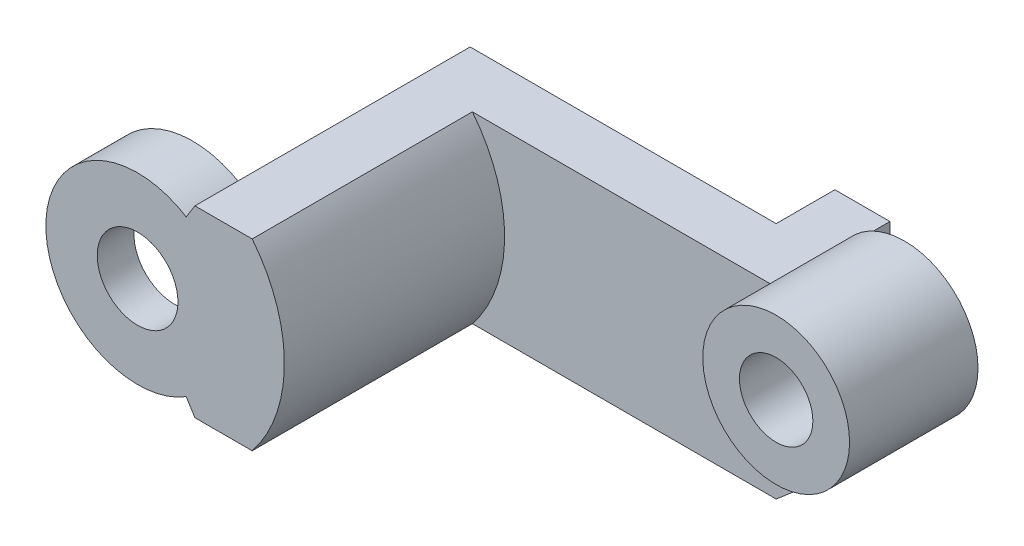
ISO-10303-21;
HEADER;
FILE_DESCRIPTION(('STEP AP214'),'2;1');
FILE_NAME('part.step','',(''),(''),'','','');
FILE_SCHEMA(('AUTOMOTIVE_DESIGN { 1 0 10303 214 1 1 1 1 }'));
ENDSEC;
DATA;
#1=APPLICATION_CONTEXT('core data for automotive mechanical design processes');
#2=APPLICATION_PROTOCOL_DEFINITION('international standard','automotive_design',2000,#1);
#3=PRODUCT_CONTEXT('',#1,'mechanical');
#4=PRODUCT('Part','Part','',(#3));
#5=PRODUCT_RELATED_PRODUCT_CATEGORY('part','',(#4));
#6=PRODUCT_DEFINITION_FORMATION('','',#4);
#7=PRODUCT_DEFINITION_CONTEXT('part definition',#1,'design');
#8=PRODUCT_DEFINITION('design','',#6,#7);
#9=PRODUCT_DEFINITION_SHAPE('','',#8);
#10=(LENGTH_UNIT() NAMED_UNIT(*) SI_UNIT(.MILLI.,.METRE.));
#11=(NAMED_UNIT(*) PLANE_ANGLE_UNIT() SI_UNIT($,.RADIAN.));
#12=(NAMED_UNIT(*) SI_UNIT($,.STERADIAN.) SOLID_ANGLE_UNIT());
#13=UNCERTAINTY_MEASURE_WITH_UNIT(LENGTH_MEASURE(1.E-05),#10,'distance_accuracy_value','');
#14=(GEOMETRIC_REPRESENTATION_CONTEXT(3) GLOBAL_UNCERTAINTY_ASSIGNED_CONTEXT((#13)) GLOBAL_UNIT_ASSIGNED_CONTEXT((#10,
#11,#12)) REPRESENTATION_CONTEXT('',''));
#15=CARTESIAN_POINT('',(0.,0.,0.));
#16=DIRECTION('',(0.,0.,1.));
#17=DIRECTION('',(1.,0.,0.));
#18=AXIS2_PLACEMENT_3D('',#15,#16,#17);
#19=CARTESIAN_POINT('',(13.4,1.84,-6.));
#20=DIRECTION('',(0.,0.,-1.));
#21=DIRECTION('',(-1.,0.,0.));
#22=AXIS2_PLACEMENT_3D('',#19,#20,#21);
#23=PLANE('',#22);
#24=CARTESIAN_POINT('',(13.4,1.84,-6.));
#25=DIRECTION('',(0.,0.,1.));
#26=DIRECTION('',(1.,0.,0.));
#27=AXIS2_PLACEMENT_3D('',#24,#25,#26);
#28=CIRCLE('',#27,2.);
#29=CARTESIAN_POINT('',(11.5120381359784,2.5,-6.));
#30=VERTEX_POINT('',#29);
#31=CARTESIAN_POINT('',(14.699339627599,0.319566991889854,-6.));
#32=VERTEX_POINT('',#31);
#33=EDGE_CURVE('E143',#30,#32,#28,.T.);
#34=ORIENTED_EDGE('',*,*,#33,.F.);
#35=DIRECTION('',(1.,0.,0.));
#36=VECTOR('',#35,1.);
#37=CARTESIAN_POINT('',(3.1224989991992,2.5,-6.));
#38=LINE('',#37,#36);
#39=CARTESIAN_POINT('',(3.1224989991992,2.5,-6.));
#40=VERTEX_POINT('',#39);
#41=EDGE_CURVE('E149',#40,#30,#38,.T.);
#42=ORIENTED_EDGE('',*,*,#41,.F.);
#43=CARTESIAN_POINT('',(0.,0.,-6.));
#44=DIRECTION('',(0.,0.,-1.));
#45=DIRECTION('',(-1.,0.,0.));
#46=AXIS2_PLACEMENT_3D('',#43,#44,#45);
#47=CIRCLE('',#46,4.);
#48=CARTESIAN_POINT('',(3.1224989991992,-2.5,-6.));
#49=VERTEX_POINT('',#48);
#50=EDGE_CURVE('E11',#49,#40,#47,.F.);
#51=ORIENTED_EDGE('',*,*,#50,.F.);
#52=DIRECTION('',(-1.,0.,0.));
#53=VECTOR('',#52,1.);
#54=CARTESIAN_POINT('',(3.1224989991992,-2.5,-6.));
#55=LINE('',#54,#53);
#56=CARTESIAN_POINT('',(11.4,-2.5,-6.));
#57=VERTEX_POINT('',#56);
#58=EDGE_CURVE('E146',#57,#49,#55,.T.);
#59=ORIENTED_EDGE('',*,*,#58,.F.);
#60=DIRECTION('',(-0.760216504055072,-0.649669813799506,0.));
#61=VECTOR('',#60,1.);
#62=CARTESIAN_POINT('',(14.699339627599,0.319566991889854,-6.));
#63=LINE('',#62,#61);
#64=EDGE_CURVE('E140',#32,#57,#63,.T.);
#65=ORIENTED_EDGE('',*,*,#64,.F.);
#66=EDGE_LOOP('',(#34,#42,#51,#59,#65));
#67=FACE_BOUND('',#66,.T.);
#68=ADVANCED_FACE('F39',(#67),#23,.F.);
#69=CARTESIAN_POINT('',(0.,0.,-7.5));
#70=DIRECTION('',(0.,0.,1.));
#71=DIRECTION('',(1.,0.,0.));
#72=AXIS2_PLACEMENT_3D('',#69,#70,#71);
#73=PLANE('',#72);
#74=CARTESIAN_POINT('',(13.4,1.84,-7.5));
#75=DIRECTION('',(0.,0.,-1.));
#76=DIRECTION('',(-1.,0.,0.));
#77=AXIS2_PLACEMENT_3D('',#74,#75,#76);
#78=CIRCLE('',#77,1.);
#79=CARTESIAN_POINT('',(12.4,1.84,-7.5));
#80=VERTEX_POINT('',#79);
#81=EDGE_CURVE('E210',#80,#80,#78,.T.);
#82=ORIENTED_EDGE('',*,*,#81,.F.);
#83=EDGE_LOOP('',(#82));
#84=FACE_BOUND('',#83,.T.);
#85=DIRECTION('',(0.,-1.,0.));
#86=VECTOR('',#85,1.);
#87=CARTESIAN_POINT('',(11.4,-2.5,-7.5));
#88=LINE('',#87,#86);
#89=CARTESIAN_POINT('',(11.4,2.5,-7.5));
#90=VERTEX_POINT('',#89);
#91=CARTESIAN_POINT('',(11.4,-2.5,-7.5));
#92=VERTEX_POINT('',#91);
#93=EDGE_CURVE('E63',#90,#92,#88,.T.);
#94=ORIENTED_EDGE('',*,*,#93,.F.);
#95=DIRECTION('',(-1.,0.,0.));
#96=VECTOR('',#95,1.);
#97=CARTESIAN_POINT('',(3.1224989991992,2.5,-7.5));
#98=LINE('',#97,#96);
#99=CARTESIAN_POINT('',(11.5120381359784,2.5,-7.5));
#100=VERTEX_POINT('',#99);
#101=EDGE_CURVE('E237',#100,#90,#98,.T.);
#102=ORIENTED_EDGE('',*,*,#101,.F.);
#103=CARTESIAN_POINT('',(13.4,1.84,-7.5));
#104=DIRECTION('',(0.,0.,-1.));
#105=DIRECTION('',(-1.,0.,0.));
#106=AXIS2_PLACEMENT_3D('',#103,#104,#105);
#107=CIRCLE('',#106,2.);
#108=CARTESIAN_POINT('',(14.699339627599,0.319566991889854,-7.5));
#109=VERTEX_POINT('',#108);
#110=EDGE_CURVE('E214',#100,#109,#107,.T.);
#111=ORIENTED_EDGE('',*,*,#110,.T.);
#112=DIRECTION('',(-0.760216504055072,-0.649669813799506,0.));
#113=VECTOR('',#112,1.);
#114=CARTESIAN_POINT('',(14.699339627599,0.319566991889854,-7.5));
#115=LINE('',#114,#113);
#116=EDGE_CURVE('E154',#109,#92,#115,.T.);
#117=ORIENTED_EDGE('',*,*,#116,.T.);
#118=EDGE_LOOP('',(#94,#102,#111,#117));
#119=FACE_BOUND('',#118,.T.);
#120=ADVANCED_FACE('F330',(#84,#119),#73,.F.);
#121=DIRECTION('',(0.,1.,0.));
#122=VECTOR('',#121,1.);
#123=CARTESIAN_POINT('',(9.9,-2.5,-7.5));
#124=LINE('',#123,#122);
#125=CARTESIAN_POINT('',(9.9,-2.5,-7.5));
#126=VERTEX_POINT('',#125);
#127=CARTESIAN_POINT('',(9.9,2.5,-7.5));
#128=VERTEX_POINT('',#127);
#129=EDGE_CURVE('E55',#126,#128,#124,.T.);
#130=ORIENTED_EDGE('',*,*,#129,.F.);
#131=DIRECTION('',(1.,0.,0.));
#132=VECTOR('',#131,1.);
#133=CARTESIAN_POINT('',(3.1224989991992,-2.5,-7.5));
#134=LINE('',#133,#132);
#135=CARTESIAN_POINT('',(1.5612494995996,-2.5,-7.5));
#136=VERTEX_POINT('',#135);
#137=EDGE_CURVE('E232',#136,#126,#134,.T.);
#138=ORIENTED_EDGE('',*,*,#137,.F.);
#139=DIRECTION('',(0.52969381681151,-0.848188929679971,0.));
#140=VECTOR('',#139,1.);
#141=CARTESIAN_POINT('',(1.5612494995996,-2.5,-7.5));
#142=LINE('',#141,#140);
#143=CARTESIAN_POINT('',(1.32423454202877,-2.12047232419993,-7.5));
#144=VERTEX_POINT('',#143);
#145=EDGE_CURVE('E228',#144,#136,#142,.T.);
#146=ORIENTED_EDGE('',*,*,#145,.F.);
#147=CARTESIAN_POINT('',(0.,0.,-7.5));
#148=DIRECTION('',(0.,0.,-1.));
#149=DIRECTION('',(1.,0.,0.));
#150=AXIS2_PLACEMENT_3D('',#147,#148,#149);
#151=CIRCLE('',#150,2.5);
#152=CARTESIAN_POINT('',(1.32423454202877,2.12047232419993,-7.5));
#153=VERTEX_POINT('',#152);
#154=EDGE_CURVE('E244',#153,#144,#151,.T.);
#155=ORIENTED_EDGE('',*,*,#154,.F.);
#156=DIRECTION('',(-0.529693816811509,-0.848188929679971,0.));
#157=VECTOR('',#156,1.);
#158=CARTESIAN_POINT('',(1.5612494995996,2.5,-7.5));
#159=LINE('',#158,#157);
#160=CARTESIAN_POINT('',(1.5612494995996,2.5,-7.5));
#161=VERTEX_POINT('',#160);
#162=EDGE_CURVE('E240',#161,#153,#159,.T.);
#163=ORIENTED_EDGE('',*,*,#162,.F.);
#164=EDGE_CURVE('E236',#128,#161,#98,.T.);
#165=ORIENTED_EDGE('',*,*,#164,.F.);
#166=EDGE_LOOP('',(#130,#138,#146,#155,#163,#165));
#167=FACE_BOUND('',#166,.T.);
#168=ADVANCED_FACE('F325',(#167),#73,.F.);
#169=CARTESIAN_POINT('',(0.,0.,-7.5));
#170=DIRECTION('',(0.,0.,1.));
#171=DIRECTION('',(1.,0.,0.));
#172=AXIS2_PLACEMENT_3D('',#169,#170,#171);
#173=CYLINDRICAL_SURFACE('',#172,4.);
#174=DIRECTION('',(0.,0.,1.));
#175=VECTOR('',#174,1.);
#176=CARTESIAN_POINT('',(3.1224989991992,-2.5,-7.5));
#177=LINE('',#176,#175);
#178=CARTESIAN_POINT('',(3.1224989991992,-2.5,0.));
#179=VERTEX_POINT('',#178);
#180=EDGE_CURVE('E284',#49,#179,#177,.T.);
#181=ORIENTED_EDGE('',*,*,#180,.F.);
#182=ORIENTED_EDGE('',*,*,#50,.T.);
#183=DIRECTION('',(0.,0.,1.));
#184=VECTOR('',#183,1.);
#185=CARTESIAN_POINT('',(3.1224989991992,2.5,-7.5));
#186=LINE('',#185,#184);
#187=CARTESIAN_POINT('',(3.1224989991992,2.5,0.));
#188=VERTEX_POINT('',#187);
#189=EDGE_CURVE('E281',#40,#188,#186,.T.);
#190=ORIENTED_EDGE('',*,*,#189,.T.);
#191=CARTESIAN_POINT('',(0.,0.,0.));
#192=DIRECTION('',(0.,0.,1.));
#193=DIRECTION('',(1.,0.,0.));
#194=AXIS2_PLACEMENT_3D('',#191,#192,#193);
#195=CIRCLE('',#194,4.);
#196=EDGE_CURVE('E256',#179,#188,#195,.T.);
#197=ORIENTED_EDGE('',*,*,#196,.F.);
#198=EDGE_LOOP('',(#181,#182,#190,#197));
#199=FACE_BOUND('',#198,.T.);
#200=ADVANCED_FACE('F316',(#199),#173,.T.);
#201=CARTESIAN_POINT('',(0.,0.,-1.));
#202=DIRECTION('',(0.,0.,1.));
#203=DIRECTION('',(1.,0.,0.));
#204=AXIS2_PLACEMENT_3D('',#201,#202,#203);
#205=PLANE('',#204);
#206=CARTESIAN_POINT('',(0.,0.,-1.));
#207=DIRECTION('',(0.,0.,1.));
#208=DIRECTION('',(1.,0.,0.));
#209=AXIS2_PLACEMENT_3D('',#206,#207,#208);
#210=CIRCLE('',#209,1.1);
#211=CARTESIAN_POINT('',(1.1,0.,-1.));
#212=VERTEX_POINT('',#211);
#213=EDGE_CURVE('E298',#212,#212,#210,.T.);
#214=ORIENTED_EDGE('',*,*,#213,.T.);
#215=EDGE_LOOP('',(#214));
#216=FACE_BOUND('',#215,.T.);
#217=CARTESIAN_POINT('',(0.,0.,-1.));
#218=DIRECTION('',(0.,0.,1.));
#219=DIRECTION('',(1.,0.,0.));
#220=AXIS2_PLACEMENT_3D('',#217,#218,#219);
#221=CIRCLE('',#220,2.05);
#222=CARTESIAN_POINT('',(2.05,0.,-1.));
#223=VERTEX_POINT('',#222);
#224=EDGE_CURVE('E48',#223,#223,#221,.T.);
#225=ORIENTED_EDGE('',*,*,#224,.F.);
#226=EDGE_LOOP('',(#225));
#227=FACE_BOUND('',#226,.T.);
#228=ADVANCED_FACE('F314',(#216,#227),#205,.F.);
#229=CARTESIAN_POINT('',(0.,0.,-1.));
#230=DIRECTION('',(0.,0.,1.));
#231=DIRECTION('',(1.,0.,0.));
#232=AXIS2_PLACEMENT_3D('',#229,#230,#231);
#233=CYLINDRICAL_SURFACE('',#232,2.5);
#234=DIRECTION('',(0.,0.,1.));
#235=VECTOR('',#234,1.);
#236=CARTESIAN_POINT('',(1.32423454202877,-2.12047232419993,-7.5));
#237=LINE('',#236,#235);
#238=CARTESIAN_POINT('',(1.32423454202877,-2.12047232419993,-1.5));
#239=VERTEX_POINT('',#238);
#240=CARTESIAN_POINT('',(1.32423454202877,-2.12047232419993,0.));
#241=VERTEX_POINT('',#240);
#242=EDGE_CURVE('E272',#239,#241,#237,.T.);
#243=ORIENTED_EDGE('',*,*,#242,.T.);
#244=CARTESIAN_POINT('',(0.,0.,0.));
#245=DIRECTION('',(0.,0.,1.));
#246=DIRECTION('',(1.,0.,0.));
#247=AXIS2_PLACEMENT_3D('',#244,#245,#246);
#248=CIRCLE('',#247,2.5);
#249=CARTESIAN_POINT('',(1.32423454202877,2.12047232419993,0.));
#250=VERTEX_POINT('',#249);
#251=EDGE_CURVE('E302',#250,#241,#248,.T.);
#252=ORIENTED_EDGE('',*,*,#251,.F.);
#253=DIRECTION('',(0.,0.,1.));
#254=VECTOR('',#253,1.);
#255=CARTESIAN_POINT('',(1.32423454202877,2.12047232419993,-7.5));
#256=LINE('',#255,#254);
#257=CARTESIAN_POINT('',(1.32423454202877,2.12047232419993,-1.5));
#258=VERTEX_POINT('',#257);
#259=EDGE_CURVE('E277',#258,#250,#256,.T.);
#260=ORIENTED_EDGE('',*,*,#259,.F.);
#261=CARTESIAN_POINT('',(0.,0.,-1.5));
#262=DIRECTION('',(0.,0.,1.));
#263=DIRECTION('',(1.,0.,0.));
#264=AXIS2_PLACEMENT_3D('',#261,#262,#263);
#265=CIRCLE('',#264,2.5);
#266=EDGE_CURVE('E293',#258,#239,#265,.T.);
#267=ORIENTED_EDGE('',*,*,#266,.T.);
#268=EDGE_LOOP('',(#243,#252,#260,#267));
#269=FACE_BOUND('',#268,.T.);
#270=ADVANCED_FACE('F41',(#269),#233,.T.);
#271=CARTESIAN_POINT('',(0.,0.,0.));
#272=DIRECTION('',(0.,0.,1.));
#273=DIRECTION('',(1.,0.,0.));
#274=AXIS2_PLACEMENT_3D('',#271,#272,#273);
#275=PLANE('',#274);
#276=CARTESIAN_POINT('',(0.,0.,0.));
#277=DIRECTION('',(0.,0.,1.));
#278=DIRECTION('',(1.,0.,0.));
#279=AXIS2_PLACEMENT_3D('',#276,#277,#278);
#280=CIRCLE('',#279,1.1);
#281=CARTESIAN_POINT('',(1.1,0.,0.));
#282=VERTEX_POINT('',#281);
#283=EDGE_CURVE('E297',#282,#282,#280,.T.);
#284=ORIENTED_EDGE('',*,*,#283,.F.);
#285=EDGE_LOOP('',(#284));
#286=FACE_BOUND('',#285,.T.);
#287=ORIENTED_EDGE('',*,*,#251,.T.);
#288=DIRECTION('',(0.52969381681151,-0.848188929679971,0.));
#289=VECTOR('',#288,1.);
#290=CARTESIAN_POINT('',(1.5612494995996,-2.5,0.));
#291=LINE('',#290,#289);
#292=CARTESIAN_POINT('',(1.5612494995996,-2.5,0.));
#293=VERTEX_POINT('',#292);
#294=EDGE_CURVE('E224',#241,#293,#291,.T.);
#295=ORIENTED_EDGE('',*,*,#294,.T.);
#296=DIRECTION('',(1.,0.,0.));
#297=VECTOR('',#296,1.);
#298=CARTESIAN_POINT('',(3.1224989991992,-2.5,0.));
#299=LINE('',#298,#297);
#300=EDGE_CURVE('E252',#293,#179,#299,.T.);
#301=ORIENTED_EDGE('',*,*,#300,.T.);
#302=ORIENTED_EDGE('',*,*,#196,.T.);
#303=DIRECTION('',(-1.,0.,0.));
#304=VECTOR('',#303,1.);
#305=CARTESIAN_POINT('',(3.1224989991992,2.5,0.));
#306=LINE('',#305,#304);
#307=CARTESIAN_POINT('',(1.5612494995996,2.5,0.));
#308=VERTEX_POINT('',#307);
#309=EDGE_CURVE('E260',#188,#308,#306,.T.);
#310=ORIENTED_EDGE('',*,*,#309,.T.);
#311=DIRECTION('',(-0.529693816811509,-0.848188929679971,0.));
#312=VECTOR('',#311,1.);
#313=CARTESIAN_POINT('',(1.5612494995996,2.5,0.));
#314=LINE('',#313,#312);
#315=EDGE_CURVE('E233',#308,#250,#314,.T.);
#316=ORIENTED_EDGE('',*,*,#315,.T.);
#317=EDGE_LOOP('',(#287,#295,#301,#302,#310,#316));
#318=FACE_BOUND('',#317,.T.);
#319=ADVANCED_FACE('F323',(#286,#318),#275,.T.);
#320=CARTESIAN_POINT('',(0.,0.,-1.));
#321=DIRECTION('',(0.,0.,1.));
#322=DIRECTION('',(1.,0.,0.));
#323=AXIS2_PLACEMENT_3D('',#320,#321,#322);
#324=CYLINDRICAL_SURFACE('',#323,1.1);
#325=ORIENTED_EDGE('',*,*,#213,.F.);
#326=EDGE_LOOP('',(#325));
#327=FACE_BOUND('',#326,.T.);
#328=ORIENTED_EDGE('',*,*,#283,.T.);
#329=EDGE_LOOP('',(#328));
#330=FACE_BOUND('',#329,.T.);
#331=ADVANCED_FACE('F371',(#327,#330),#324,.F.);
#332=CARTESIAN_POINT('',(0.,0.,-1.5));
#333=DIRECTION('',(0.,0.,1.));
#334=DIRECTION('',(1.,0.,0.));
#335=AXIS2_PLACEMENT_3D('',#332,#333,#334);
#336=PLANE('',#335);
#337=CARTESIAN_POINT('',(0.,0.,-1.5));
#338=DIRECTION('',(0.,0.,1.));
#339=DIRECTION('',(1.,0.,0.));
#340=AXIS2_PLACEMENT_3D('',#337,#338,#339);
#341=CIRCLE('',#340,2.05);
#342=CARTESIAN_POINT('',(2.05,0.,-1.5));
#343=VERTEX_POINT('',#342);
#344=EDGE_CURVE('E271',#343,#343,#341,.T.);
#345=ORIENTED_EDGE('',*,*,#344,.T.);
#346=EDGE_LOOP('',(#345));
#347=FACE_BOUND('',#346,.T.);
#348=ORIENTED_EDGE('',*,*,#266,.F.);
#349=EDGE_CURVE('E292',#239,#258,#265,.T.);
#350=ORIENTED_EDGE('',*,*,#349,.F.);
#351=EDGE_LOOP('',(#348,#350));
#352=FACE_BOUND('',#351,.T.);
#353=ADVANCED_FACE('F368',(#347,#352),#336,.F.);
#354=CARTESIAN_POINT('',(0.,0.,-1.5));
#355=DIRECTION('',(0.,0.,1.));
#356=DIRECTION('',(1.,0.,0.));
#357=AXIS2_PLACEMENT_3D('',#354,#355,#356);
#358=CYLINDRICAL_SURFACE('',#357,2.05);
#359=ORIENTED_EDGE('',*,*,#344,.F.);
#360=EDGE_LOOP('',(#359));
#361=FACE_BOUND('',#360,.T.);
#362=ORIENTED_EDGE('',*,*,#224,.T.);
#363=EDGE_LOOP('',(#362));
#364=FACE_BOUND('',#363,.T.);
#365=ADVANCED_FACE('F312',(#361,#364),#358,.F.);
#366=CARTESIAN_POINT('',(0.,0.,-7.5));
#367=DIRECTION('',(0.,0.,1.));
#368=DIRECTION('',(1.,0.,0.));
#369=AXIS2_PLACEMENT_3D('',#366,#367,#368);
#370=CYLINDRICAL_SURFACE('',#369,2.5);
#371=ORIENTED_EDGE('',*,*,#349,.T.);
#372=EDGE_CURVE('E273',#153,#258,#256,.T.);
#373=ORIENTED_EDGE('',*,*,#372,.F.);
#374=ORIENTED_EDGE('',*,*,#154,.T.);
#375=EDGE_CURVE('E267',#144,#239,#237,.T.);
#376=ORIENTED_EDGE('',*,*,#375,.T.);
#377=EDGE_LOOP('',(#371,#373,#374,#376));
#378=FACE_BOUND('',#377,.T.);
#379=ADVANCED_FACE('F348',(#378),#370,.F.);
#380=CARTESIAN_POINT('',(1.5612494995996,-2.5,-7.5));
#381=DIRECTION('',(-0.848188929679971,-0.52969381681151,0.));
#382=DIRECTION('',(0.52969381681151,-0.848188929679971,0.));
#383=AXIS2_PLACEMENT_3D('',#380,#381,#382);
#384=PLANE('',#383);
#385=ORIENTED_EDGE('',*,*,#294,.F.);
#386=ORIENTED_EDGE('',*,*,#242,.F.);
#387=ORIENTED_EDGE('',*,*,#375,.F.);
#388=ORIENTED_EDGE('',*,*,#145,.T.);
#389=DIRECTION('',(0.,0.,1.));
#390=VECTOR('',#389,1.);
#391=CARTESIAN_POINT('',(1.5612494995996,-2.5,-7.5));
#392=LINE('',#391,#390);
#393=EDGE_CURVE('E248',#136,#293,#392,.T.);
#394=ORIENTED_EDGE('',*,*,#393,.T.);
#395=EDGE_LOOP('',(#385,#386,#387,#388,#394));
#396=FACE_BOUND('',#395,.T.);
#397=ADVANCED_FACE('F351',(#396),#384,.T.);
#398=CARTESIAN_POINT('',(1.5612494995996,2.5,-7.5));
#399=DIRECTION('',(-0.848188929679971,0.529693816811509,0.));
#400=DIRECTION('',(-0.529693816811509,-0.848188929679971,0.));
#401=AXIS2_PLACEMENT_3D('',#398,#399,#400);
#402=PLANE('',#401);
#403=ORIENTED_EDGE('',*,*,#315,.F.);
#404=DIRECTION('',(0.,0.,1.));
#405=VECTOR('',#404,1.);
#406=CARTESIAN_POINT('',(1.5612494995996,2.5,-7.5));
#407=LINE('',#406,#405);
#408=EDGE_CURVE('E278',#161,#308,#407,.T.);
#409=ORIENTED_EDGE('',*,*,#408,.F.);
#410=ORIENTED_EDGE('',*,*,#162,.T.);
#411=ORIENTED_EDGE('',*,*,#372,.T.);
#412=ORIENTED_EDGE('',*,*,#259,.T.);
#413=EDGE_LOOP('',(#403,#409,#410,#411,#412));
#414=FACE_BOUND('',#413,.T.);
#415=ADVANCED_FACE('F353',(#414),#402,.T.);
#416=CARTESIAN_POINT('',(3.1224989991992,2.5,-7.5));
#417=DIRECTION('',(0.,1.,0.));
#418=DIRECTION('',(0.,0.,1.));
#419=AXIS2_PLACEMENT_3D('',#416,#417,#418);
#420=PLANE('',#419);
#421=ORIENTED_EDGE('',*,*,#309,.F.);
#422=ORIENTED_EDGE('',*,*,#189,.F.);
#423=ORIENTED_EDGE('',*,*,#41,.T.);
#424=DIRECTION('',(0.,0.,-1.));
#425=VECTOR('',#424,1.);
#426=CARTESIAN_POINT('',(11.5120381359784,2.5,-6.));
#427=LINE('',#426,#425);
#428=EDGE_CURVE('E160',#30,#100,#427,.T.);
#429=ORIENTED_EDGE('',*,*,#428,.T.);
#430=ORIENTED_EDGE('',*,*,#101,.T.);
#431=DIRECTION('',(0.,0.,1.));
#432=VECTOR('',#431,1.);
#433=CARTESIAN_POINT('',(11.4,2.5,-9.1));
#434=LINE('',#433,#432);
#435=CARTESIAN_POINT('',(11.4,2.5,-9.1));
#436=VERTEX_POINT('',#435);
#437=EDGE_CURVE('E190',#436,#90,#434,.T.);
#438=ORIENTED_EDGE('',*,*,#437,.F.);
#439=DIRECTION('',(1.,0.,0.));
#440=VECTOR('',#439,1.);
#441=CARTESIAN_POINT('',(11.4,2.5,-9.1));
#442=LINE('',#441,#440);
#443=CARTESIAN_POINT('',(9.9,2.5,-9.1));
#444=VERTEX_POINT('',#443);
#445=EDGE_CURVE('E187',#444,#436,#442,.T.);
#446=ORIENTED_EDGE('',*,*,#445,.F.);
#447=DIRECTION('',(0.,0.,1.));
#448=VECTOR('',#447,1.);
#449=CARTESIAN_POINT('',(9.9,2.5,-9.1));
#450=LINE('',#449,#448);
#451=EDGE_CURVE('E198',#444,#128,#450,.T.);
#452=ORIENTED_EDGE('',*,*,#451,.T.);
#453=ORIENTED_EDGE('',*,*,#164,.T.);
#454=ORIENTED_EDGE('',*,*,#408,.T.);
#455=EDGE_LOOP('',(#421,#422,#423,#429,#430,#438,#446,#452,#453,#454));
#456=FACE_BOUND('',#455,.T.);
#457=ADVANCED_FACE('F356',(#456),#420,.T.);
#458=CARTESIAN_POINT('',(3.1224989991992,-2.5,-7.5));
#459=DIRECTION('',(0.,-1.,0.));
#460=DIRECTION('',(0.,0.,-1.));
#461=AXIS2_PLACEMENT_3D('',#458,#459,#460);
#462=PLANE('',#461);
#463=ORIENTED_EDGE('',*,*,#300,.F.);
#464=ORIENTED_EDGE('',*,*,#393,.F.);
#465=ORIENTED_EDGE('',*,*,#137,.T.);
#466=DIRECTION('',(0.,0.,1.));
#467=VECTOR('',#466,1.);
#468=CARTESIAN_POINT('',(9.9,-2.5,-9.1));
#469=LINE('',#468,#467);
#470=CARTESIAN_POINT('',(9.9,-2.5,-9.1));
#471=VERTEX_POINT('',#470);
#472=EDGE_CURVE('E202',#471,#126,#469,.T.);
#473=ORIENTED_EDGE('',*,*,#472,.F.);
#474=DIRECTION('',(-1.,0.,0.));
#475=VECTOR('',#474,1.);
#476=CARTESIAN_POINT('',(11.4,-2.5,-9.1));
#477=LINE('',#476,#475);
#478=CARTESIAN_POINT('',(11.4,-2.5,-9.1));
#479=VERTEX_POINT('',#478);
#480=EDGE_CURVE('E181',#479,#471,#477,.T.);
#481=ORIENTED_EDGE('',*,*,#480,.F.);
#482=DIRECTION('',(0.,0.,1.));
#483=VECTOR('',#482,1.);
#484=CARTESIAN_POINT('',(11.4,-2.5,-9.1));
#485=LINE('',#484,#483);
#486=EDGE_CURVE('E206',#479,#92,#485,.T.);
#487=ORIENTED_EDGE('',*,*,#486,.T.);
#488=DIRECTION('',(0.,0.,-1.));
#489=VECTOR('',#488,1.);
#490=CARTESIAN_POINT('',(11.4,-2.5,-6.));
#491=LINE('',#490,#489);
#492=EDGE_CURVE('E159',#57,#92,#491,.T.);
#493=ORIENTED_EDGE('',*,*,#492,.F.);
#494=ORIENTED_EDGE('',*,*,#58,.T.);
#495=ORIENTED_EDGE('',*,*,#180,.T.);
#496=EDGE_LOOP('',(#463,#464,#465,#473,#481,#487,#493,#494,#495));
#497=FACE_BOUND('',#496,.T.);
#498=ADVANCED_FACE('F345',(#497),#462,.T.);
#499=CARTESIAN_POINT('',(14.699339627599,0.319566991889854,-6.));
#500=DIRECTION('',(0.649669813799506,-0.760216504055072,0.));
#501=DIRECTION('',(0.760216504055072,0.649669813799506,0.));
#502=AXIS2_PLACEMENT_3D('',#499,#500,#501);
#503=PLANE('',#502);
#504=ORIENTED_EDGE('',*,*,#116,.F.);
#505=DIRECTION('',(0.,0.,-1.));
#506=VECTOR('',#505,1.);
#507=CARTESIAN_POINT('',(14.699339627599,0.319566991889854,-6.));
#508=LINE('',#507,#506);
#509=EDGE_CURVE('E152',#32,#109,#508,.T.);
#510=ORIENTED_EDGE('',*,*,#509,.F.);
#511=ORIENTED_EDGE('',*,*,#64,.T.);
#512=ORIENTED_EDGE('',*,*,#492,.T.);
#513=EDGE_LOOP('',(#504,#510,#511,#512));
#514=FACE_BOUND('',#513,.T.);
#515=ADVANCED_FACE('F153',(#514),#503,.T.);
#516=CARTESIAN_POINT('',(13.4,1.84,-6.));
#517=DIRECTION('',(0.,0.,-1.));
#518=DIRECTION('',(-1.,0.,0.));
#519=AXIS2_PLACEMENT_3D('',#516,#517,#518);
#520=CYLINDRICAL_SURFACE('',#519,2.);
#521=ORIENTED_EDGE('',*,*,#110,.F.);
#522=ORIENTED_EDGE('',*,*,#428,.F.);
#523=ORIENTED_EDGE('',*,*,#33,.T.);
#524=ORIENTED_EDGE('',*,*,#509,.T.);
#525=EDGE_LOOP('',(#521,#522,#523,#524));
#526=FACE_BOUND('',#525,.T.);
#527=CARTESIAN_POINT('',(13.4,1.84,-4.));
#528=DIRECTION('',(0.,0.,1.));
#529=DIRECTION('',(1.,0.,0.));
#530=AXIS2_PLACEMENT_3D('',#527,#528,#529);
#531=CIRCLE('',#530,2.);
#532=CARTESIAN_POINT('',(15.4,1.84,-4.));
#533=VERTEX_POINT('',#532);
#534=EDGE_CURVE('E167',#533,#533,#531,.T.);
#535=ORIENTED_EDGE('',*,*,#534,.F.);
#536=EDGE_LOOP('',(#535));
#537=FACE_BOUND('',#536,.T.);
#538=ADVANCED_FACE('F162',(#526,#537),#520,.T.);
#539=CARTESIAN_POINT('',(13.4,1.84,-6.));
#540=DIRECTION('',(0.,0.,-1.));
#541=DIRECTION('',(-1.,0.,0.));
#542=AXIS2_PLACEMENT_3D('',#539,#540,#541);
#543=CYLINDRICAL_SURFACE('',#542,1.);
#544=ORIENTED_EDGE('',*,*,#81,.T.);
#545=EDGE_LOOP('',(#544));
#546=FACE_BOUND('',#545,.T.);
#547=CARTESIAN_POINT('',(13.4,1.84,-4.));
#548=DIRECTION('',(0.,0.,1.));
#549=DIRECTION('',(1.,0.,0.));
#550=AXIS2_PLACEMENT_3D('',#547,#548,#549);
#551=CIRCLE('',#550,1.);
#552=CARTESIAN_POINT('',(14.4,1.84,-4.));
#553=VERTEX_POINT('',#552);
#554=EDGE_CURVE('E168',#553,#553,#551,.T.);
#555=ORIENTED_EDGE('',*,*,#554,.T.);
#556=EDGE_LOOP('',(#555));
#557=FACE_BOUND('',#556,.T.);
#558=ADVANCED_FACE('F341',(#546,#557),#543,.F.);
#559=CARTESIAN_POINT('',(11.4,-2.5,-9.1));
#560=DIRECTION('',(-1.,0.,0.));
#561=DIRECTION('',(0.,0.,1.));
#562=AXIS2_PLACEMENT_3D('',#559,#560,#561);
#563=PLANE('',#562);
#564=ORIENTED_EDGE('',*,*,#93,.T.);
#565=ORIENTED_EDGE('',*,*,#486,.F.);
#566=DIRECTION('',(0.,-1.,0.));
#567=VECTOR('',#566,1.);
#568=CARTESIAN_POINT('',(11.4,-2.5,-9.1));
#569=LINE('',#568,#567);
#570=EDGE_CURVE('E177',#436,#479,#569,.T.);
#571=ORIENTED_EDGE('',*,*,#570,.F.);
#572=ORIENTED_EDGE('',*,*,#437,.T.);
#573=EDGE_LOOP('',(#564,#565,#571,#572));
#574=FACE_BOUND('',#573,.T.);
#575=ADVANCED_FACE('F415',(#574),#563,.F.);
#576=CARTESIAN_POINT('',(9.9,-2.5,-9.1));
#577=DIRECTION('',(1.,0.,0.));
#578=DIRECTION('',(0.,0.,-1.));
#579=AXIS2_PLACEMENT_3D('',#576,#577,#578);
#580=PLANE('',#579);
#581=ORIENTED_EDGE('',*,*,#129,.T.);
#582=ORIENTED_EDGE('',*,*,#451,.F.);
#583=DIRECTION('',(0.,1.,0.));
#584=VECTOR('',#583,1.);
#585=CARTESIAN_POINT('',(9.9,-2.5,-9.1));
#586=LINE('',#585,#584);
#587=EDGE_CURVE('E184',#471,#444,#586,.T.);
#588=ORIENTED_EDGE('',*,*,#587,.F.);
#589=ORIENTED_EDGE('',*,*,#472,.T.);
#590=EDGE_LOOP('',(#581,#582,#588,#589));
#591=FACE_BOUND('',#590,.T.);
#592=ADVANCED_FACE('F406',(#591),#580,.F.);
#593=CARTESIAN_POINT('',(0.,0.,-9.1));
#594=DIRECTION('',(0.,0.,1.));
#595=DIRECTION('',(1.,0.,0.));
#596=AXIS2_PLACEMENT_3D('',#593,#594,#595);
#597=PLANE('',#596);
#598=ORIENTED_EDGE('',*,*,#570,.T.);
#599=ORIENTED_EDGE('',*,*,#480,.T.);
#600=ORIENTED_EDGE('',*,*,#587,.T.);
#601=ORIENTED_EDGE('',*,*,#445,.T.);
#602=EDGE_LOOP('',(#598,#599,#600,#601));
#603=FACE_BOUND('',#602,.T.);
#604=ADVANCED_FACE('F410',(#603),#597,.F.);
#605=CARTESIAN_POINT('',(13.4,1.84,-4.));
#606=DIRECTION('',(0.,0.,1.));
#607=DIRECTION('',(1.,0.,0.));
#608=AXIS2_PLACEMENT_3D('',#605,#606,#607);
#609=PLANE('',#608);
#610=ORIENTED_EDGE('',*,*,#534,.T.);
#611=EDGE_LOOP('',(#610));
#612=FACE_BOUND('',#611,.T.);
#613=ORIENTED_EDGE('',*,*,#554,.F.);
#614=EDGE_LOOP('',(#613));
#615=FACE_BOUND('',#614,.T.);
#616=ADVANCED_FACE('F426',(#612,#615),#609,.T.);
#617=CLOSED_SHELL('',(#68,#120,#168,#200,#228,#270,#319,#331,#353,#365,#379,#397,#415,#457,#498,
#515,#538,#558,#575,#592,#604,#616));
#618=MANIFOLD_SOLID_BREP('B2',#617);
#619=ADVANCED_BREP_SHAPE_REPRESENTATION('',(#18,#618),#14);
#620=SHAPE_DEFINITION_REPRESENTATION(#9,#619);
ENDSEC;
END-ISO-10303-21;
